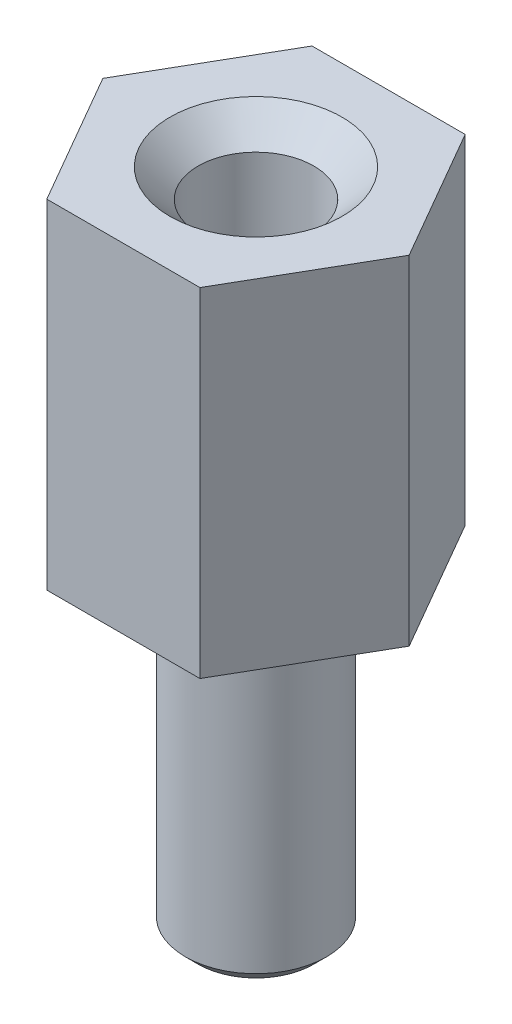
ISO-10303-21;
HEADER;
FILE_DESCRIPTION(('STEP AP214'),'2;1');
FILE_NAME('part.step','',(''),(''),'','','');
FILE_SCHEMA(('AUTOMOTIVE_DESIGN { 1 0 10303 214 1 1 1 1 }'));
ENDSEC;
DATA;
#1=APPLICATION_CONTEXT('core data for automotive mechanical design processes');
#2=APPLICATION_PROTOCOL_DEFINITION('international standard','automotive_design',2000,#1);
#3=PRODUCT_CONTEXT('',#1,'mechanical');
#4=PRODUCT('Part','Part','',(#3));
#5=PRODUCT_RELATED_PRODUCT_CATEGORY('part','',(#4));
#6=PRODUCT_DEFINITION_FORMATION('','',#4);
#7=PRODUCT_DEFINITION_CONTEXT('part definition',#1,'design');
#8=PRODUCT_DEFINITION('design','',#6,#7);
#9=PRODUCT_DEFINITION_SHAPE('','',#8);
#10=(LENGTH_UNIT() NAMED_UNIT(*) SI_UNIT(.MILLI.,.METRE.));
#11=(NAMED_UNIT(*) PLANE_ANGLE_UNIT() SI_UNIT($,.RADIAN.));
#12=(NAMED_UNIT(*) SI_UNIT($,.STERADIAN.) SOLID_ANGLE_UNIT());
#13=UNCERTAINTY_MEASURE_WITH_UNIT(LENGTH_MEASURE(1.E-05),#10,'distance_accuracy_value','');
#14=(GEOMETRIC_REPRESENTATION_CONTEXT(3) GLOBAL_UNCERTAINTY_ASSIGNED_CONTEXT((#13)) GLOBAL_UNIT_ASSIGNED_CONTEXT((#10,
#11,#12)) REPRESENTATION_CONTEXT('',''));
#15=CARTESIAN_POINT('',(0.,0.,0.));
#16=DIRECTION('',(0.,0.,1.));
#17=DIRECTION('',(1.,0.,0.));
#18=AXIS2_PLACEMENT_3D('',#15,#16,#17);
#19=CARTESIAN_POINT('',(-1.35677313259562,0.,2.35));
#20=DIRECTION('',(0.,0.,1.));
#21=DIRECTION('',(1.,0.,0.));
#22=AXIS2_PLACEMENT_3D('',#19,#20,#21);
#23=PLANE('',#22);
#24=DIRECTION('',(1.,0.,0.));
#25=VECTOR('',#24,1.);
#26=CARTESIAN_POINT('',(-1.35677313259562,6.,2.35));
#27=LINE('',#26,#25);
#28=CARTESIAN_POINT('',(-1.35677313259562,6.,2.35));
#29=VERTEX_POINT('',#28);
#30=CARTESIAN_POINT('',(1.35677313259562,6.,2.35));
#31=VERTEX_POINT('',#30);
#32=EDGE_CURVE('E124',#29,#31,#27,.T.);
#33=ORIENTED_EDGE('',*,*,#32,.F.);
#34=DIRECTION('',(0.,1.,0.));
#35=VECTOR('',#34,1.);
#36=CARTESIAN_POINT('',(-1.35677313259562,0.,2.35));
#37=LINE('',#36,#35);
#38=CARTESIAN_POINT('',(-1.35677313259562,0.,2.35));
#39=VERTEX_POINT('',#38);
#40=EDGE_CURVE('E53',#39,#29,#37,.T.);
#41=ORIENTED_EDGE('',*,*,#40,.F.);
#42=DIRECTION('',(1.,0.,0.));
#43=VECTOR('',#42,1.);
#44=CARTESIAN_POINT('',(-1.35677313259562,0.,2.35));
#45=LINE('',#44,#43);
#46=CARTESIAN_POINT('',(1.35677313259562,0.,2.35));
#47=VERTEX_POINT('',#46);
#48=EDGE_CURVE('E140',#39,#47,#45,.T.);
#49=ORIENTED_EDGE('',*,*,#48,.T.);
#50=DIRECTION('',(0.,1.,0.));
#51=VECTOR('',#50,1.);
#52=CARTESIAN_POINT('',(1.35677313259562,0.,2.35));
#53=LINE('',#52,#51);
#54=EDGE_CURVE('E88',#47,#31,#53,.T.);
#55=ORIENTED_EDGE('',*,*,#54,.T.);
#56=EDGE_LOOP('',(#33,#41,#49,#55));
#57=FACE_BOUND('',#56,.T.);
#58=ADVANCED_FACE('F35',(#57),#23,.T.);
#59=CARTESIAN_POINT('',(-2.71354626519124,0.,0.));
#60=DIRECTION('',(-0.866025403784439,0.,0.5));
#61=DIRECTION('',(0.5,0.,0.866025403784439));
#62=AXIS2_PLACEMENT_3D('',#59,#60,#61);
#63=PLANE('',#62);
#64=DIRECTION('',(0.5,0.,0.866025403784438));
#65=VECTOR('',#64,1.);
#66=CARTESIAN_POINT('',(-2.71354626519124,6.,0.));
#67=LINE('',#66,#65);
#68=CARTESIAN_POINT('',(-2.71354626519124,6.,0.));
#69=VERTEX_POINT('',#68);
#70=EDGE_CURVE('E137',#69,#29,#67,.T.);
#71=ORIENTED_EDGE('',*,*,#70,.F.);
#72=DIRECTION('',(0.,1.,0.));
#73=VECTOR('',#72,1.);
#74=CARTESIAN_POINT('',(-2.71354626519124,0.,0.));
#75=LINE('',#74,#73);
#76=CARTESIAN_POINT('',(-2.71354626519124,0.,0.));
#77=VERTEX_POINT('',#76);
#78=EDGE_CURVE('E76',#77,#69,#75,.T.);
#79=ORIENTED_EDGE('',*,*,#78,.F.);
#80=DIRECTION('',(0.5,0.,0.866025403784438));
#81=VECTOR('',#80,1.);
#82=CARTESIAN_POINT('',(-2.71354626519124,0.,0.));
#83=LINE('',#82,#81);
#84=EDGE_CURVE('E114',#77,#39,#83,.T.);
#85=ORIENTED_EDGE('',*,*,#84,.T.);
#86=ORIENTED_EDGE('',*,*,#40,.T.);
#87=EDGE_LOOP('',(#71,#79,#85,#86));
#88=FACE_BOUND('',#87,.T.);
#89=ADVANCED_FACE('F176',(#88),#63,.T.);
#90=CARTESIAN_POINT('',(-1.35677313259562,0.,-2.35));
#91=DIRECTION('',(-0.866025403784438,0.,-0.500000000000001));
#92=DIRECTION('',(-0.500000000000001,0.,0.866025403784438));
#93=AXIS2_PLACEMENT_3D('',#90,#91,#92);
#94=PLANE('',#93);
#95=DIRECTION('',(-0.5,0.,0.866025403784438));
#96=VECTOR('',#95,1.);
#97=CARTESIAN_POINT('',(-1.35677313259562,6.,-2.35));
#98=LINE('',#97,#96);
#99=CARTESIAN_POINT('',(-1.35677313259562,6.,-2.35));
#100=VERTEX_POINT('',#99);
#101=EDGE_CURVE('E101',#100,#69,#98,.T.);
#102=ORIENTED_EDGE('',*,*,#101,.F.);
#103=DIRECTION('',(0.,1.,0.));
#104=VECTOR('',#103,1.);
#105=CARTESIAN_POINT('',(-1.35677313259562,0.,-2.35));
#106=LINE('',#105,#104);
#107=CARTESIAN_POINT('',(-1.35677313259562,0.,-2.35));
#108=VERTEX_POINT('',#107);
#109=EDGE_CURVE('E96',#108,#100,#106,.T.);
#110=ORIENTED_EDGE('',*,*,#109,.F.);
#111=DIRECTION('',(-0.5,0.,0.866025403784438));
#112=VECTOR('',#111,1.);
#113=CARTESIAN_POINT('',(-1.35677313259562,0.,-2.35));
#114=LINE('',#113,#112);
#115=EDGE_CURVE('E99',#108,#77,#114,.T.);
#116=ORIENTED_EDGE('',*,*,#115,.T.);
#117=ORIENTED_EDGE('',*,*,#78,.T.);
#118=EDGE_LOOP('',(#102,#110,#116,#117));
#119=FACE_BOUND('',#118,.T.);
#120=ADVANCED_FACE('F98',(#119),#94,.T.);
#121=CARTESIAN_POINT('',(1.35677313259562,0.,-2.35));
#122=DIRECTION('',(0.,0.,-1.));
#123=DIRECTION('',(-1.,0.,0.));
#124=AXIS2_PLACEMENT_3D('',#121,#122,#123);
#125=PLANE('',#124);
#126=DIRECTION('',(-1.,0.,0.));
#127=VECTOR('',#126,1.);
#128=CARTESIAN_POINT('',(1.35677313259562,6.,-2.35));
#129=LINE('',#128,#127);
#130=CARTESIAN_POINT('',(1.35677313259562,6.,-2.35));
#131=VERTEX_POINT('',#130);
#132=EDGE_CURVE('E134',#131,#100,#129,.T.);
#133=ORIENTED_EDGE('',*,*,#132,.F.);
#134=DIRECTION('',(0.,1.,0.));
#135=VECTOR('',#134,1.);
#136=CARTESIAN_POINT('',(1.35677313259562,0.,-2.35));
#137=LINE('',#136,#135);
#138=CARTESIAN_POINT('',(1.35677313259562,0.,-2.35));
#139=VERTEX_POINT('',#138);
#140=EDGE_CURVE('E106',#139,#131,#137,.T.);
#141=ORIENTED_EDGE('',*,*,#140,.F.);
#142=DIRECTION('',(-1.,0.,0.));
#143=VECTOR('',#142,1.);
#144=CARTESIAN_POINT('',(1.35677313259562,0.,-2.35));
#145=LINE('',#144,#143);
#146=EDGE_CURVE('E112',#139,#108,#145,.T.);
#147=ORIENTED_EDGE('',*,*,#146,.T.);
#148=ORIENTED_EDGE('',*,*,#109,.T.);
#149=EDGE_LOOP('',(#133,#141,#147,#148));
#150=FACE_BOUND('',#149,.T.);
#151=ADVANCED_FACE('F116',(#150),#125,.T.);
#152=CARTESIAN_POINT('',(2.71354626519124,0.,0.));
#153=DIRECTION('',(0.866025403784439,0.,-0.5));
#154=DIRECTION('',(-0.5,0.,-0.866025403784439));
#155=AXIS2_PLACEMENT_3D('',#152,#153,#154);
#156=PLANE('',#155);
#157=DIRECTION('',(-0.5,0.,-0.866025403784438));
#158=VECTOR('',#157,1.);
#159=CARTESIAN_POINT('',(2.71354626519124,6.,0.));
#160=LINE('',#159,#158);
#161=CARTESIAN_POINT('',(2.71354626519124,6.,0.));
#162=VERTEX_POINT('',#161);
#163=EDGE_CURVE('E131',#162,#131,#160,.T.);
#164=ORIENTED_EDGE('',*,*,#163,.F.);
#165=DIRECTION('',(0.,1.,0.));
#166=VECTOR('',#165,1.);
#167=CARTESIAN_POINT('',(2.71354626519124,0.,0.));
#168=LINE('',#167,#166);
#169=CARTESIAN_POINT('',(2.71354626519124,0.,0.));
#170=VERTEX_POINT('',#169);
#171=EDGE_CURVE('E145',#170,#162,#168,.T.);
#172=ORIENTED_EDGE('',*,*,#171,.F.);
#173=DIRECTION('',(-0.5,0.,-0.866025403784438));
#174=VECTOR('',#173,1.);
#175=CARTESIAN_POINT('',(2.71354626519124,0.,0.));
#176=LINE('',#175,#174);
#177=EDGE_CURVE('E117',#170,#139,#176,.T.);
#178=ORIENTED_EDGE('',*,*,#177,.T.);
#179=ORIENTED_EDGE('',*,*,#140,.T.);
#180=EDGE_LOOP('',(#164,#172,#178,#179));
#181=FACE_BOUND('',#180,.T.);
#182=ADVANCED_FACE('F190',(#181),#156,.T.);
#183=CARTESIAN_POINT('',(1.35677313259562,0.,2.35));
#184=DIRECTION('',(0.866025403784438,0.,0.5));
#185=DIRECTION('',(0.5,0.,-0.866025403784438));
#186=AXIS2_PLACEMENT_3D('',#183,#184,#185);
#187=PLANE('',#186);
#188=DIRECTION('',(0.5,0.,-0.866025403784438));
#189=VECTOR('',#188,1.);
#190=CARTESIAN_POINT('',(1.35677313259562,6.,2.35));
#191=LINE('',#190,#189);
#192=EDGE_CURVE('E127',#31,#162,#191,.T.);
#193=ORIENTED_EDGE('',*,*,#192,.F.);
#194=ORIENTED_EDGE('',*,*,#54,.F.);
#195=DIRECTION('',(0.5,0.,-0.866025403784438));
#196=VECTOR('',#195,1.);
#197=CARTESIAN_POINT('',(1.35677313259562,0.,2.35));
#198=LINE('',#197,#196);
#199=EDGE_CURVE('E119',#47,#170,#198,.T.);
#200=ORIENTED_EDGE('',*,*,#199,.T.);
#201=ORIENTED_EDGE('',*,*,#171,.T.);
#202=EDGE_LOOP('',(#193,#194,#200,#201));
#203=FACE_BOUND('',#202,.T.);
#204=ADVANCED_FACE('F173',(#203),#187,.T.);
#205=CARTESIAN_POINT('',(0.,0.,0.));
#206=DIRECTION('',(0.,1.,0.));
#207=DIRECTION('',(0.,0.,1.));
#208=AXIS2_PLACEMENT_3D('',#205,#206,#207);
#209=PLANE('',#208);
#210=CARTESIAN_POINT('',(0.,0.,0.));
#211=DIRECTION('',(0.,1.,0.));
#212=DIRECTION('',(0.,0.,1.));
#213=AXIS2_PLACEMENT_3D('',#210,#211,#212);
#214=CIRCLE('',#213,1.25);
#215=CARTESIAN_POINT('',(0.,0.,1.25));
#216=VERTEX_POINT('',#215);
#217=EDGE_CURVE('E128',#216,#216,#214,.T.);
#218=ORIENTED_EDGE('',*,*,#217,.T.);
#219=EDGE_LOOP('',(#218));
#220=FACE_BOUND('',#219,.T.);
#221=ORIENTED_EDGE('',*,*,#48,.F.);
#222=ORIENTED_EDGE('',*,*,#84,.F.);
#223=ORIENTED_EDGE('',*,*,#115,.F.);
#224=ORIENTED_EDGE('',*,*,#146,.F.);
#225=ORIENTED_EDGE('',*,*,#177,.F.);
#226=ORIENTED_EDGE('',*,*,#199,.F.);
#227=EDGE_LOOP('',(#221,#222,#223,#224,#225,#226));
#228=FACE_BOUND('',#227,.T.);
#229=ADVANCED_FACE('F110',(#220,#228),#209,.F.);
#230=CARTESIAN_POINT('',(0.,6.,0.));
#231=DIRECTION('',(0.,1.,0.));
#232=DIRECTION('',(0.,0.,1.));
#233=AXIS2_PLACEMENT_3D('',#230,#231,#232);
#234=PLANE('',#233);
#235=CARTESIAN_POINT('',(0.,6.,0.));
#236=DIRECTION('',(0.,1.,0.));
#237=DIRECTION('',(0.,0.,1.));
#238=AXIS2_PLACEMENT_3D('',#235,#236,#237);
#239=CIRCLE('',#238,1.525);
#240=CARTESIAN_POINT('',(0.,6.,1.525));
#241=VERTEX_POINT('',#240);
#242=EDGE_CURVE('E11',#241,#241,#239,.F.);
#243=ORIENTED_EDGE('',*,*,#242,.T.);
#244=EDGE_LOOP('',(#243));
#245=FACE_BOUND('',#244,.T.);
#246=ORIENTED_EDGE('',*,*,#32,.T.);
#247=ORIENTED_EDGE('',*,*,#192,.T.);
#248=ORIENTED_EDGE('',*,*,#163,.T.);
#249=ORIENTED_EDGE('',*,*,#132,.T.);
#250=ORIENTED_EDGE('',*,*,#101,.T.);
#251=ORIENTED_EDGE('',*,*,#70,.T.);
#252=EDGE_LOOP('',(#246,#247,#248,#249,#250,#251));
#253=FACE_BOUND('',#252,.T.);
#254=ADVANCED_FACE('F166',(#245,#253),#234,.T.);
#255=CARTESIAN_POINT('',(0.,-6.,0.));
#256=DIRECTION('',(0.,1.,0.));
#257=DIRECTION('',(0.,0.,1.));
#258=AXIS2_PLACEMENT_3D('',#255,#256,#257);
#259=CYLINDRICAL_SURFACE('',#258,1.25);
#260=CARTESIAN_POINT('',(0.,-5.49999999999999,0.));
#261=DIRECTION('',(0.,-1.,0.));
#262=DIRECTION('',(0.,0.,-1.));
#263=AXIS2_PLACEMENT_3D('',#260,#261,#262);
#264=CIRCLE('',#263,1.25);
#265=CARTESIAN_POINT('',(0.,-5.49999999999999,-1.25));
#266=VERTEX_POINT('',#265);
#267=EDGE_CURVE('E142',#266,#266,#264,.F.);
#268=ORIENTED_EDGE('',*,*,#267,.T.);
#269=EDGE_LOOP('',(#268));
#270=FACE_BOUND('',#269,.T.);
#271=ORIENTED_EDGE('',*,*,#217,.F.);
#272=EDGE_LOOP('',(#271));
#273=FACE_BOUND('',#272,.T.);
#274=ADVANCED_FACE('F163',(#270,#273),#259,.T.);
#275=CARTESIAN_POINT('',(0.,6.,0.));
#276=DIRECTION('',(0.,1.,0.));
#277=DIRECTION('',(0.,0.,1.));
#278=AXIS2_PLACEMENT_3D('',#275,#276,#277);
#279=CYLINDRICAL_SURFACE('',#278,1.025);
#280=CARTESIAN_POINT('',(0.,-5.725,0.));
#281=DIRECTION('',(0.,1.,0.));
#282=DIRECTION('',(0.,0.,1.));
#283=AXIS2_PLACEMENT_3D('',#280,#281,#282);
#284=CIRCLE('',#283,1.025);
#285=CARTESIAN_POINT('',(0.,-5.725,1.025));
#286=VERTEX_POINT('',#285);
#287=EDGE_CURVE('E45',#286,#286,#284,.F.);
#288=ORIENTED_EDGE('',*,*,#287,.T.);
#289=EDGE_LOOP('',(#288));
#290=FACE_BOUND('',#289,.T.);
#291=CARTESIAN_POINT('',(0.,5.5,0.));
#292=DIRECTION('',(0.,1.,0.));
#293=DIRECTION('',(0.,0.,1.));
#294=AXIS2_PLACEMENT_3D('',#291,#292,#293);
#295=CIRCLE('',#294,1.025);
#296=CARTESIAN_POINT('',(0.,5.5,1.025));
#297=VERTEX_POINT('',#296);
#298=EDGE_CURVE('E150',#297,#297,#295,.T.);
#299=ORIENTED_EDGE('',*,*,#298,.T.);
#300=EDGE_LOOP('',(#299));
#301=FACE_BOUND('',#300,.T.);
#302=ADVANCED_FACE('F155',(#290,#301),#279,.F.);
#303=CARTESIAN_POINT('',(0.,-5.49999999999999,0.));
#304=DIRECTION('',(0.,1.,0.));
#305=DIRECTION('',(0.,0.,1.));
#306=AXIS2_PLACEMENT_3D('',#303,#304,#305);
#307=CONICAL_SURFACE('',#306,1.25,0.785398163397445);
#308=ORIENTED_EDGE('',*,*,#287,.F.);
#309=EDGE_LOOP('',(#308));
#310=FACE_BOUND('',#309,.T.);
#311=ORIENTED_EDGE('',*,*,#267,.F.);
#312=EDGE_LOOP('',(#311));
#313=FACE_BOUND('',#312,.T.);
#314=ADVANCED_FACE('F158',(#310,#313),#307,.T.);
#315=CARTESIAN_POINT('',(0.,5.5,0.));
#316=DIRECTION('',(0.,1.,0.));
#317=DIRECTION('',(0.,0.,1.));
#318=AXIS2_PLACEMENT_3D('',#315,#316,#317);
#319=CONICAL_SURFACE('',#318,1.025,0.78539816339745);
#320=ORIENTED_EDGE('',*,*,#242,.F.);
#321=EDGE_LOOP('',(#320));
#322=FACE_BOUND('',#321,.T.);
#323=ORIENTED_EDGE('',*,*,#298,.F.);
#324=EDGE_LOOP('',(#323));
#325=FACE_BOUND('',#324,.T.);
#326=ADVANCED_FACE('F38',(#322,#325),#319,.F.);
#327=CLOSED_SHELL('',(#58,#89,#120,#151,#182,#204,#229,#254,#274,#302,#314,#326));
#328=MANIFOLD_SOLID_BREP('B2',#327);
#329=ADVANCED_BREP_SHAPE_REPRESENTATION('',(#18,#328),#14);
#330=SHAPE_DEFINITION_REPRESENTATION(#9,#329);
ENDSEC;
END-ISO-10303-21;
